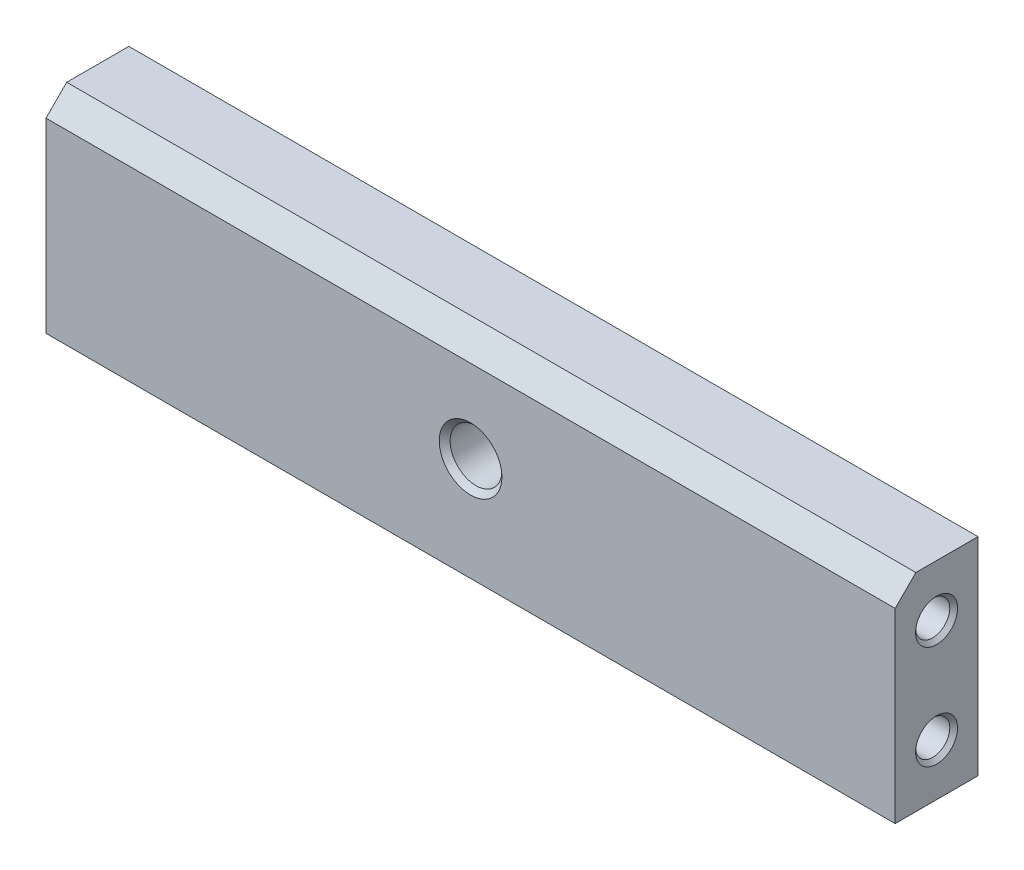
ISO-10303-21;
HEADER;
FILE_DESCRIPTION(('STEP AP214'),'2;1');
FILE_NAME('part.step','',(''),(''),'','','');
FILE_SCHEMA(('AUTOMOTIVE_DESIGN { 1 0 10303 214 1 1 1 1 }'));
ENDSEC;
DATA;
#1=APPLICATION_CONTEXT('core data for automotive mechanical design processes');
#2=APPLICATION_PROTOCOL_DEFINITION('international standard','automotive_design',2000,#1);
#3=PRODUCT_CONTEXT('',#1,'mechanical');
#4=PRODUCT('Part','Part','',(#3));
#5=PRODUCT_RELATED_PRODUCT_CATEGORY('part','',(#4));
#6=PRODUCT_DEFINITION_FORMATION('','',#4);
#7=PRODUCT_DEFINITION_CONTEXT('part definition',#1,'design');
#8=PRODUCT_DEFINITION('design','',#6,#7);
#9=PRODUCT_DEFINITION_SHAPE('','',#8);
#10=(LENGTH_UNIT() NAMED_UNIT(*) SI_UNIT(.MILLI.,.METRE.));
#11=(NAMED_UNIT(*) PLANE_ANGLE_UNIT() SI_UNIT($,.RADIAN.));
#12=(NAMED_UNIT(*) SI_UNIT($,.STERADIAN.) SOLID_ANGLE_UNIT());
#13=UNCERTAINTY_MEASURE_WITH_UNIT(LENGTH_MEASURE(1.E-05),#10,'distance_accuracy_value','');
#14=(GEOMETRIC_REPRESENTATION_CONTEXT(3) GLOBAL_UNCERTAINTY_ASSIGNED_CONTEXT((#13)) GLOBAL_UNIT_ASSIGNED_CONTEXT((#10,
#11,#12)) REPRESENTATION_CONTEXT('',''));
#15=CARTESIAN_POINT('',(0.,0.,0.));
#16=DIRECTION('',(0.,0.,1.));
#17=DIRECTION('',(1.,0.,0.));
#18=AXIS2_PLACEMENT_3D('',#15,#16,#17);
#19=CARTESIAN_POINT('',(0.,0.,8.));
#20=DIRECTION('',(1.,0.,0.));
#21=DIRECTION('',(0.,0.,-1.));
#22=AXIS2_PLACEMENT_3D('',#19,#20,#21);
#23=PLANE('',#22);
#24=CARTESIAN_POINT('',(0.,15.,4.));
#25=DIRECTION('',(-1.,0.,0.));
#26=DIRECTION('',(0.,0.,1.));
#27=AXIS2_PLACEMENT_3D('',#24,#25,#26);
#28=CIRCLE('',#27,2.025);
#29=CARTESIAN_POINT('',(0.,15.,6.025));
#30=VERTEX_POINT('',#29);
#31=EDGE_CURVE('E120',#30,#30,#28,.T.);
#32=ORIENTED_EDGE('',*,*,#31,.F.);
#33=EDGE_LOOP('',(#32));
#34=FACE_BOUND('',#33,.T.);
#35=CARTESIAN_POINT('',(0.,5.,4.));
#36=DIRECTION('',(-1.,0.,0.));
#37=DIRECTION('',(0.,0.,1.));
#38=AXIS2_PLACEMENT_3D('',#35,#36,#37);
#39=CIRCLE('',#38,2.025);
#40=CARTESIAN_POINT('',(0.,5.,6.025));
#41=VERTEX_POINT('',#40);
#42=EDGE_CURVE('E129',#41,#41,#39,.T.);
#43=ORIENTED_EDGE('',*,*,#42,.F.);
#44=EDGE_LOOP('',(#43));
#45=FACE_BOUND('',#44,.T.);
#46=DIRECTION('',(0.,-1.,0.));
#47=VECTOR('',#46,1.);
#48=CARTESIAN_POINT('',(0.,0.,8.));
#49=LINE('',#48,#47);
#50=CARTESIAN_POINT('',(0.,18.,8.));
#51=VERTEX_POINT('',#50);
#52=CARTESIAN_POINT('',(0.,0.,8.));
#53=VERTEX_POINT('',#52);
#54=EDGE_CURVE('E148',#51,#53,#49,.T.);
#55=ORIENTED_EDGE('',*,*,#54,.F.);
#56=DIRECTION('',(0.,-0.707106781186546,0.707106781186549));
#57=VECTOR('',#56,1.);
#58=CARTESIAN_POINT('',(0.,18.,8.));
#59=LINE('',#58,#57);
#60=CARTESIAN_POINT('',(0.,20.,5.99999999999998));
#61=VERTEX_POINT('',#60);
#62=EDGE_CURVE('E61',#51,#61,#59,.F.);
#63=ORIENTED_EDGE('',*,*,#62,.T.);
#64=DIRECTION('',(0.,0.,-1.));
#65=VECTOR('',#64,1.);
#66=CARTESIAN_POINT('',(0.,20.,8.));
#67=LINE('',#66,#65);
#68=CARTESIAN_POINT('',(0.,20.,0.));
#69=VERTEX_POINT('',#68);
#70=EDGE_CURVE('E156',#61,#69,#67,.T.);
#71=ORIENTED_EDGE('',*,*,#70,.T.);
#72=DIRECTION('',(0.,-1.,0.));
#73=VECTOR('',#72,1.);
#74=CARTESIAN_POINT('',(0.,0.,0.));
#75=LINE('',#74,#73);
#76=CARTESIAN_POINT('',(0.,0.,0.));
#77=VERTEX_POINT('',#76);
#78=EDGE_CURVE('E147',#69,#77,#75,.T.);
#79=ORIENTED_EDGE('',*,*,#78,.T.);
#80=DIRECTION('',(0.,0.,-1.));
#81=VECTOR('',#80,1.);
#82=CARTESIAN_POINT('',(0.,0.,8.));
#83=LINE('',#82,#81);
#84=EDGE_CURVE('E172',#53,#77,#83,.T.);
#85=ORIENTED_EDGE('',*,*,#84,.F.);
#86=EDGE_LOOP('',(#55,#63,#71,#79,#85));
#87=FACE_BOUND('',#86,.T.);
#88=ADVANCED_FACE('F39',(#34,#45,#87),#23,.F.);
#89=CARTESIAN_POINT('',(0.,0.,8.));
#90=DIRECTION('',(0.,1.,0.));
#91=DIRECTION('',(0.,0.,1.));
#92=AXIS2_PLACEMENT_3D('',#89,#90,#91);
#93=PLANE('',#92);
#94=DIRECTION('',(1.,0.,0.));
#95=VECTOR('',#94,1.);
#96=CARTESIAN_POINT('',(0.,0.,0.));
#97=LINE('',#96,#95);
#98=CARTESIAN_POINT('',(82.,0.,0.));
#99=VERTEX_POINT('',#98);
#100=EDGE_CURVE('E159',#77,#99,#97,.T.);
#101=ORIENTED_EDGE('',*,*,#100,.T.);
#102=DIRECTION('',(0.,0.,-1.));
#103=VECTOR('',#102,1.);
#104=CARTESIAN_POINT('',(82.,0.,8.));
#105=LINE('',#104,#103);
#106=CARTESIAN_POINT('',(82.,0.,8.));
#107=VERTEX_POINT('',#106);
#108=EDGE_CURVE('E169',#107,#99,#105,.T.);
#109=ORIENTED_EDGE('',*,*,#108,.F.);
#110=DIRECTION('',(1.,0.,0.));
#111=VECTOR('',#110,1.);
#112=CARTESIAN_POINT('',(0.,0.,8.));
#113=LINE('',#112,#111);
#114=EDGE_CURVE('E150',#53,#107,#113,.T.);
#115=ORIENTED_EDGE('',*,*,#114,.F.);
#116=ORIENTED_EDGE('',*,*,#84,.T.);
#117=EDGE_LOOP('',(#101,#109,#115,#116));
#118=FACE_BOUND('',#117,.T.);
#119=ADVANCED_FACE('F188',(#118),#93,.F.);
#120=CARTESIAN_POINT('',(82.,0.,8.));
#121=DIRECTION('',(-1.,0.,0.));
#122=DIRECTION('',(0.,0.,1.));
#123=AXIS2_PLACEMENT_3D('',#120,#121,#122);
#124=PLANE('',#123);
#125=CARTESIAN_POINT('',(82.,15.,4.));
#126=DIRECTION('',(1.,0.,0.));
#127=DIRECTION('',(0.,0.,-1.));
#128=AXIS2_PLACEMENT_3D('',#125,#126,#127);
#129=CIRCLE('',#128,2.025);
#130=CARTESIAN_POINT('',(82.,15.,1.975));
#131=VERTEX_POINT('',#130);
#132=EDGE_CURVE('E111',#131,#131,#129,.T.);
#133=ORIENTED_EDGE('',*,*,#132,.F.);
#134=EDGE_LOOP('',(#133));
#135=FACE_BOUND('',#134,.T.);
#136=CARTESIAN_POINT('',(82.,5.,4.));
#137=DIRECTION('',(1.,0.,0.));
#138=DIRECTION('',(0.,0.,-1.));
#139=AXIS2_PLACEMENT_3D('',#136,#137,#138);
#140=CIRCLE('',#139,2.025);
#141=CARTESIAN_POINT('',(82.,5.,1.975));
#142=VERTEX_POINT('',#141);
#143=EDGE_CURVE('E104',#142,#142,#140,.T.);
#144=ORIENTED_EDGE('',*,*,#143,.F.);
#145=EDGE_LOOP('',(#144));
#146=FACE_BOUND('',#145,.T.);
#147=DIRECTION('',(0.,0.,-1.));
#148=VECTOR('',#147,1.);
#149=CARTESIAN_POINT('',(82.,20.,8.));
#150=LINE('',#149,#148);
#151=CARTESIAN_POINT('',(82.,20.,5.99999999999998));
#152=VERTEX_POINT('',#151);
#153=CARTESIAN_POINT('',(82.,20.,0.));
#154=VERTEX_POINT('',#153);
#155=EDGE_CURVE('E167',#152,#154,#150,.T.);
#156=ORIENTED_EDGE('',*,*,#155,.F.);
#157=DIRECTION('',(0.,0.707106781186546,-0.707106781186549));
#158=VECTOR('',#157,1.);
#159=CARTESIAN_POINT('',(82.,18.,8.));
#160=LINE('',#159,#158);
#161=CARTESIAN_POINT('',(82.,18.,8.));
#162=VERTEX_POINT('',#161);
#163=EDGE_CURVE('E11',#152,#162,#160,.F.);
#164=ORIENTED_EDGE('',*,*,#163,.T.);
#165=DIRECTION('',(0.,1.,0.));
#166=VECTOR('',#165,1.);
#167=CARTESIAN_POINT('',(82.,0.,8.));
#168=LINE('',#167,#166);
#169=EDGE_CURVE('E153',#107,#162,#168,.T.);
#170=ORIENTED_EDGE('',*,*,#169,.F.);
#171=ORIENTED_EDGE('',*,*,#108,.T.);
#172=DIRECTION('',(0.,1.,0.));
#173=VECTOR('',#172,1.);
#174=CARTESIAN_POINT('',(82.,0.,0.));
#175=LINE('',#174,#173);
#176=EDGE_CURVE('E161',#99,#154,#175,.T.);
#177=ORIENTED_EDGE('',*,*,#176,.T.);
#178=EDGE_LOOP('',(#156,#164,#170,#171,#177));
#179=FACE_BOUND('',#178,.T.);
#180=ADVANCED_FACE('F192',(#135,#146,#179),#124,.F.);
#181=CARTESIAN_POINT('',(0.,20.,8.));
#182=DIRECTION('',(0.,-1.,0.));
#183=DIRECTION('',(0.,0.,-1.));
#184=AXIS2_PLACEMENT_3D('',#181,#182,#183);
#185=PLANE('',#184);
#186=ORIENTED_EDGE('',*,*,#70,.F.);
#187=DIRECTION('',(1.,0.,0.));
#188=VECTOR('',#187,1.);
#189=CARTESIAN_POINT('',(0.,20.,5.99999999999998));
#190=LINE('',#189,#188);
#191=EDGE_CURVE('E47',#61,#152,#190,.T.);
#192=ORIENTED_EDGE('',*,*,#191,.T.);
#193=ORIENTED_EDGE('',*,*,#155,.T.);
#194=DIRECTION('',(-1.,0.,0.));
#195=VECTOR('',#194,1.);
#196=CARTESIAN_POINT('',(0.,20.,0.));
#197=LINE('',#196,#195);
#198=EDGE_CURVE('E151',#154,#69,#197,.T.);
#199=ORIENTED_EDGE('',*,*,#198,.T.);
#200=EDGE_LOOP('',(#186,#192,#193,#199));
#201=FACE_BOUND('',#200,.T.);
#202=ADVANCED_FACE('F211',(#201),#185,.F.);
#203=CARTESIAN_POINT('',(0.,0.,8.));
#204=DIRECTION('',(0.,0.,-1.));
#205=DIRECTION('',(-1.,0.,0.));
#206=AXIS2_PLACEMENT_3D('',#203,#204,#205);
#207=PLANE('',#206);
#208=CARTESIAN_POINT('',(41.,10.,8.));
#209=DIRECTION('',(0.,0.,1.));
#210=DIRECTION('',(1.,0.,0.));
#211=AXIS2_PLACEMENT_3D('',#208,#209,#210);
#212=CIRCLE('',#211,3.025);
#213=CARTESIAN_POINT('',(44.025,10.,8.));
#214=VERTEX_POINT('',#213);
#215=EDGE_CURVE('E138',#214,#214,#212,.T.);
#216=ORIENTED_EDGE('',*,*,#215,.F.);
#217=EDGE_LOOP('',(#216));
#218=FACE_BOUND('',#217,.T.);
#219=ORIENTED_EDGE('',*,*,#169,.T.);
#220=DIRECTION('',(-1.,0.,0.));
#221=VECTOR('',#220,1.);
#222=CARTESIAN_POINT('',(0.,18.,8.));
#223=LINE('',#222,#221);
#224=EDGE_CURVE('E175',#162,#51,#223,.T.);
#225=ORIENTED_EDGE('',*,*,#224,.T.);
#226=ORIENTED_EDGE('',*,*,#54,.T.);
#227=ORIENTED_EDGE('',*,*,#114,.T.);
#228=EDGE_LOOP('',(#219,#225,#226,#227));
#229=FACE_BOUND('',#228,.T.);
#230=ADVANCED_FACE('F180',(#218,#229),#207,.F.);
#231=CARTESIAN_POINT('',(0.,0.,0.));
#232=DIRECTION('',(0.,0.,-1.));
#233=DIRECTION('',(-1.,0.,0.));
#234=AXIS2_PLACEMENT_3D('',#231,#232,#233);
#235=PLANE('',#234);
#236=CARTESIAN_POINT('',(41.,10.,0.));
#237=DIRECTION('',(0.,0.,-1.));
#238=DIRECTION('',(-1.,0.,0.));
#239=AXIS2_PLACEMENT_3D('',#236,#237,#238);
#240=CIRCLE('',#239,2.5);
#241=CARTESIAN_POINT('',(38.5,10.,0.));
#242=VERTEX_POINT('',#241);
#243=EDGE_CURVE('E144',#242,#242,#240,.T.);
#244=ORIENTED_EDGE('',*,*,#243,.F.);
#245=EDGE_LOOP('',(#244));
#246=FACE_BOUND('',#245,.T.);
#247=ORIENTED_EDGE('',*,*,#78,.F.);
#248=ORIENTED_EDGE('',*,*,#198,.F.);
#249=ORIENTED_EDGE('',*,*,#176,.F.);
#250=ORIENTED_EDGE('',*,*,#100,.F.);
#251=EDGE_LOOP('',(#247,#248,#249,#250));
#252=FACE_BOUND('',#251,.T.);
#253=ADVANCED_FACE('F215',(#246,#252),#235,.T.);
#254=CARTESIAN_POINT('',(41.,10.,8.));
#255=DIRECTION('',(0.,0.,1.));
#256=DIRECTION('',(1.,0.,0.));
#257=AXIS2_PLACEMENT_3D('',#254,#255,#256);
#258=CYLINDRICAL_SURFACE('',#257,2.5);
#259=CARTESIAN_POINT('',(41.,10.,7.475));
#260=DIRECTION('',(0.,0.,1.));
#261=DIRECTION('',(1.,0.,0.));
#262=AXIS2_PLACEMENT_3D('',#259,#260,#261);
#263=CIRCLE('',#262,2.5);
#264=CARTESIAN_POINT('',(43.5,10.,7.475));
#265=VERTEX_POINT('',#264);
#266=EDGE_CURVE('E141',#265,#265,#263,.T.);
#267=ORIENTED_EDGE('',*,*,#266,.T.);
#268=EDGE_LOOP('',(#267));
#269=FACE_BOUND('',#268,.T.);
#270=ORIENTED_EDGE('',*,*,#243,.T.);
#271=EDGE_LOOP('',(#270));
#272=FACE_BOUND('',#271,.T.);
#273=ADVANCED_FACE('F218',(#269,#272),#258,.F.);
#274=CARTESIAN_POINT('',(41.,10.,8.));
#275=DIRECTION('',(0.,0.,1.));
#276=DIRECTION('',(1.,0.,0.));
#277=AXIS2_PLACEMENT_3D('',#274,#275,#276);
#278=CONICAL_SURFACE('',#277,3.025,0.785398163397452);
#279=ORIENTED_EDGE('',*,*,#266,.F.);
#280=EDGE_LOOP('',(#279));
#281=FACE_BOUND('',#280,.T.);
#282=ORIENTED_EDGE('',*,*,#215,.T.);
#283=EDGE_LOOP('',(#282));
#284=FACE_BOUND('',#283,.T.);
#285=ADVANCED_FACE('F225',(#281,#284),#278,.F.);
#286=CARTESIAN_POINT('',(11.5,5.,4.));
#287=DIRECTION('',(-1.,0.,0.));
#288=DIRECTION('',(0.,0.,1.));
#289=AXIS2_PLACEMENT_3D('',#286,#287,#288);
#290=CONICAL_SURFACE('',#289,1.65,1.02974425867665);
#291=CARTESIAN_POINT('',(12.4914200213955,5.,4.));
#292=VERTEX_POINT('',#291);
#293=VERTEX_LOOP('',#292);
#294=FACE_BOUND('',#293,.T.);
#295=CARTESIAN_POINT('',(11.5,5.,4.));
#296=DIRECTION('',(-1.,0.,0.));
#297=DIRECTION('',(0.,0.,1.));
#298=AXIS2_PLACEMENT_3D('',#295,#296,#297);
#299=CIRCLE('',#298,1.65);
#300=CARTESIAN_POINT('',(11.5,5.,5.65));
#301=VERTEX_POINT('',#300);
#302=EDGE_CURVE('E135',#301,#301,#299,.T.);
#303=ORIENTED_EDGE('',*,*,#302,.T.);
#304=EDGE_LOOP('',(#303));
#305=FACE_BOUND('',#304,.T.);
#306=ADVANCED_FACE('F229',(#294,#305),#290,.F.);
#307=CARTESIAN_POINT('',(0.,5.,4.));
#308=DIRECTION('',(-1.,0.,0.));
#309=DIRECTION('',(0.,0.,1.));
#310=AXIS2_PLACEMENT_3D('',#307,#308,#309);
#311=CYLINDRICAL_SURFACE('',#310,1.65);
#312=ORIENTED_EDGE('',*,*,#302,.F.);
#313=EDGE_LOOP('',(#312));
#314=FACE_BOUND('',#313,.T.);
#315=CARTESIAN_POINT('',(0.375,5.,4.));
#316=DIRECTION('',(-1.,0.,0.));
#317=DIRECTION('',(0.,0.,1.));
#318=AXIS2_PLACEMENT_3D('',#315,#316,#317);
#319=CIRCLE('',#318,1.65);
#320=CARTESIAN_POINT('',(0.375,5.,5.65));
#321=VERTEX_POINT('',#320);
#322=EDGE_CURVE('E132',#321,#321,#319,.T.);
#323=ORIENTED_EDGE('',*,*,#322,.T.);
#324=EDGE_LOOP('',(#323));
#325=FACE_BOUND('',#324,.T.);
#326=ADVANCED_FACE('F233',(#314,#325),#311,.F.);
#327=CARTESIAN_POINT('',(0.,5.,4.));
#328=DIRECTION('',(-1.,0.,0.));
#329=DIRECTION('',(0.,0.,1.));
#330=AXIS2_PLACEMENT_3D('',#327,#328,#329);
#331=CONICAL_SURFACE('',#330,2.025,0.78539816339745);
#332=ORIENTED_EDGE('',*,*,#322,.F.);
#333=EDGE_LOOP('',(#332));
#334=FACE_BOUND('',#333,.T.);
#335=ORIENTED_EDGE('',*,*,#42,.T.);
#336=EDGE_LOOP('',(#335));
#337=FACE_BOUND('',#336,.T.);
#338=ADVANCED_FACE('F237',(#334,#337),#331,.F.);
#339=CARTESIAN_POINT('',(11.5,15.,4.));
#340=DIRECTION('',(-1.,0.,0.));
#341=DIRECTION('',(0.,0.,1.));
#342=AXIS2_PLACEMENT_3D('',#339,#340,#341);
#343=CONICAL_SURFACE('',#342,1.65,1.02974425867665);
#344=CARTESIAN_POINT('',(12.4914200213955,15.,4.));
#345=VERTEX_POINT('',#344);
#346=VERTEX_LOOP('',#345);
#347=FACE_BOUND('',#346,.T.);
#348=CARTESIAN_POINT('',(11.5,15.,4.));
#349=DIRECTION('',(-1.,0.,0.));
#350=DIRECTION('',(0.,0.,1.));
#351=AXIS2_PLACEMENT_3D('',#348,#349,#350);
#352=CIRCLE('',#351,1.65);
#353=CARTESIAN_POINT('',(11.5,15.,5.65));
#354=VERTEX_POINT('',#353);
#355=EDGE_CURVE('E126',#354,#354,#352,.T.);
#356=ORIENTED_EDGE('',*,*,#355,.T.);
#357=EDGE_LOOP('',(#356));
#358=FACE_BOUND('',#357,.T.);
#359=ADVANCED_FACE('F241',(#347,#358),#343,.F.);
#360=CARTESIAN_POINT('',(0.,15.,4.));
#361=DIRECTION('',(-1.,0.,0.));
#362=DIRECTION('',(0.,0.,1.));
#363=AXIS2_PLACEMENT_3D('',#360,#361,#362);
#364=CYLINDRICAL_SURFACE('',#363,1.65);
#365=ORIENTED_EDGE('',*,*,#355,.F.);
#366=EDGE_LOOP('',(#365));
#367=FACE_BOUND('',#366,.T.);
#368=CARTESIAN_POINT('',(0.375,15.,4.));
#369=DIRECTION('',(-1.,0.,0.));
#370=DIRECTION('',(0.,0.,1.));
#371=AXIS2_PLACEMENT_3D('',#368,#369,#370);
#372=CIRCLE('',#371,1.65);
#373=CARTESIAN_POINT('',(0.375,15.,5.65));
#374=VERTEX_POINT('',#373);
#375=EDGE_CURVE('E123',#374,#374,#372,.T.);
#376=ORIENTED_EDGE('',*,*,#375,.T.);
#377=EDGE_LOOP('',(#376));
#378=FACE_BOUND('',#377,.T.);
#379=ADVANCED_FACE('F245',(#367,#378),#364,.F.);
#380=CARTESIAN_POINT('',(0.,15.,4.));
#381=DIRECTION('',(-1.,0.,0.));
#382=DIRECTION('',(0.,0.,1.));
#383=AXIS2_PLACEMENT_3D('',#380,#381,#382);
#384=CONICAL_SURFACE('',#383,2.025,0.785398163397448);
#385=ORIENTED_EDGE('',*,*,#375,.F.);
#386=EDGE_LOOP('',(#385));
#387=FACE_BOUND('',#386,.T.);
#388=ORIENTED_EDGE('',*,*,#31,.T.);
#389=EDGE_LOOP('',(#388));
#390=FACE_BOUND('',#389,.T.);
#391=ADVANCED_FACE('F249',(#387,#390),#384,.F.);
#392=CARTESIAN_POINT('',(70.5,5.,4.));
#393=DIRECTION('',(1.,0.,0.));
#394=DIRECTION('',(0.,0.,-1.));
#395=AXIS2_PLACEMENT_3D('',#392,#393,#394);
#396=CONICAL_SURFACE('',#395,1.65,1.02974425867665);
#397=CARTESIAN_POINT('',(69.5085799786045,5.,4.));
#398=VERTEX_POINT('',#397);
#399=VERTEX_LOOP('',#398);
#400=FACE_BOUND('',#399,.T.);
#401=CARTESIAN_POINT('',(70.5,5.,4.));
#402=DIRECTION('',(1.,0.,0.));
#403=DIRECTION('',(0.,0.,-1.));
#404=AXIS2_PLACEMENT_3D('',#401,#402,#403);
#405=CIRCLE('',#404,1.65);
#406=CARTESIAN_POINT('',(70.5,5.,2.35000000000001));
#407=VERTEX_POINT('',#406);
#408=EDGE_CURVE('E117',#407,#407,#405,.T.);
#409=ORIENTED_EDGE('',*,*,#408,.T.);
#410=EDGE_LOOP('',(#409));
#411=FACE_BOUND('',#410,.T.);
#412=ADVANCED_FACE('F253',(#400,#411),#396,.F.);
#413=CARTESIAN_POINT('',(82.,5.,4.));
#414=DIRECTION('',(1.,0.,0.));
#415=DIRECTION('',(0.,0.,-1.));
#416=AXIS2_PLACEMENT_3D('',#413,#414,#415);
#417=CYLINDRICAL_SURFACE('',#416,1.65);
#418=ORIENTED_EDGE('',*,*,#408,.F.);
#419=EDGE_LOOP('',(#418));
#420=FACE_BOUND('',#419,.T.);
#421=CARTESIAN_POINT('',(81.625,5.,4.));
#422=DIRECTION('',(1.,0.,0.));
#423=DIRECTION('',(0.,0.,-1.));
#424=AXIS2_PLACEMENT_3D('',#421,#422,#423);
#425=CIRCLE('',#424,1.65);
#426=CARTESIAN_POINT('',(81.625,5.,2.35));
#427=VERTEX_POINT('',#426);
#428=EDGE_CURVE('E108',#427,#427,#425,.T.);
#429=ORIENTED_EDGE('',*,*,#428,.T.);
#430=EDGE_LOOP('',(#429));
#431=FACE_BOUND('',#430,.T.);
#432=ADVANCED_FACE('F257',(#420,#431),#417,.F.);
#433=CARTESIAN_POINT('',(82.,5.,4.));
#434=DIRECTION('',(1.,0.,0.));
#435=DIRECTION('',(0.,0.,-1.));
#436=AXIS2_PLACEMENT_3D('',#433,#434,#435);
#437=CONICAL_SURFACE('',#436,2.025,0.78539816339745);
#438=ORIENTED_EDGE('',*,*,#428,.F.);
#439=EDGE_LOOP('',(#438));
#440=FACE_BOUND('',#439,.T.);
#441=ORIENTED_EDGE('',*,*,#143,.T.);
#442=EDGE_LOOP('',(#441));
#443=FACE_BOUND('',#442,.T.);
#444=ADVANCED_FACE('F98',(#440,#443),#437,.F.);
#445=CARTESIAN_POINT('',(70.5,15.,4.));
#446=DIRECTION('',(1.,0.,0.));
#447=DIRECTION('',(0.,0.,-1.));
#448=AXIS2_PLACEMENT_3D('',#445,#446,#447);
#449=CONICAL_SURFACE('',#448,1.65,1.02974425867665);
#450=CARTESIAN_POINT('',(69.5085799786045,15.,4.));
#451=VERTEX_POINT('',#450);
#452=VERTEX_LOOP('',#451);
#453=FACE_BOUND('',#452,.T.);
#454=CARTESIAN_POINT('',(70.5,15.,4.));
#455=DIRECTION('',(1.,0.,0.));
#456=DIRECTION('',(0.,0.,-1.));
#457=AXIS2_PLACEMENT_3D('',#454,#455,#456);
#458=CIRCLE('',#457,1.65);
#459=CARTESIAN_POINT('',(70.5,15.,2.35000000000001));
#460=VERTEX_POINT('',#459);
#461=EDGE_CURVE('E102',#460,#460,#458,.T.);
#462=ORIENTED_EDGE('',*,*,#461,.T.);
#463=EDGE_LOOP('',(#462));
#464=FACE_BOUND('',#463,.T.);
#465=ADVANCED_FACE('F94',(#453,#464),#449,.F.);
#466=CARTESIAN_POINT('',(82.,15.,4.));
#467=DIRECTION('',(1.,0.,0.));
#468=DIRECTION('',(0.,0.,-1.));
#469=AXIS2_PLACEMENT_3D('',#466,#467,#468);
#470=CYLINDRICAL_SURFACE('',#469,1.65);
#471=ORIENTED_EDGE('',*,*,#461,.F.);
#472=EDGE_LOOP('',(#471));
#473=FACE_BOUND('',#472,.T.);
#474=CARTESIAN_POINT('',(81.625,15.,4.));
#475=DIRECTION('',(1.,0.,0.));
#476=DIRECTION('',(0.,0.,-1.));
#477=AXIS2_PLACEMENT_3D('',#474,#475,#476);
#478=CIRCLE('',#477,1.65);
#479=CARTESIAN_POINT('',(81.625,15.,2.35));
#480=VERTEX_POINT('',#479);
#481=EDGE_CURVE('E105',#480,#480,#478,.T.);
#482=ORIENTED_EDGE('',*,*,#481,.T.);
#483=EDGE_LOOP('',(#482));
#484=FACE_BOUND('',#483,.T.);
#485=ADVANCED_FACE('F97',(#473,#484),#470,.F.);
#486=CARTESIAN_POINT('',(82.,15.,4.));
#487=DIRECTION('',(1.,0.,0.));
#488=DIRECTION('',(0.,0.,-1.));
#489=AXIS2_PLACEMENT_3D('',#486,#487,#488);
#490=CONICAL_SURFACE('',#489,2.025,0.785398163397448);
#491=ORIENTED_EDGE('',*,*,#481,.F.);
#492=EDGE_LOOP('',(#491));
#493=FACE_BOUND('',#492,.T.);
#494=ORIENTED_EDGE('',*,*,#132,.T.);
#495=EDGE_LOOP('',(#494));
#496=FACE_BOUND('',#495,.T.);
#497=ADVANCED_FACE('F194',(#493,#496),#490,.F.);
#498=CARTESIAN_POINT('',(0.,18.,8.));
#499=DIRECTION('',(0.,-0.707106781186549,-0.707106781186546));
#500=DIRECTION('',(-1.,0.,0.));
#501=AXIS2_PLACEMENT_3D('',#498,#499,#500);
#502=PLANE('',#501);
#503=ORIENTED_EDGE('',*,*,#163,.F.);
#504=ORIENTED_EDGE('',*,*,#191,.F.);
#505=ORIENTED_EDGE('',*,*,#62,.F.);
#506=ORIENTED_EDGE('',*,*,#224,.F.);
#507=EDGE_LOOP('',(#503,#504,#505,#506));
#508=FACE_BOUND('',#507,.T.);
#509=ADVANCED_FACE('F41',(#508),#502,.F.);
#510=CLOSED_SHELL('',(#88,#119,#180,#202,#230,#253,#273,#285,#306,#326,#338,#359,#379,#391,#412,
#432,#444,#465,#485,#497,#509));
#511=MANIFOLD_SOLID_BREP('B2',#510);
#512=ADVANCED_BREP_SHAPE_REPRESENTATION('',(#18,#511),#14);
#513=SHAPE_DEFINITION_REPRESENTATION(#9,#512);
ENDSEC;
END-ISO-10303-21;
